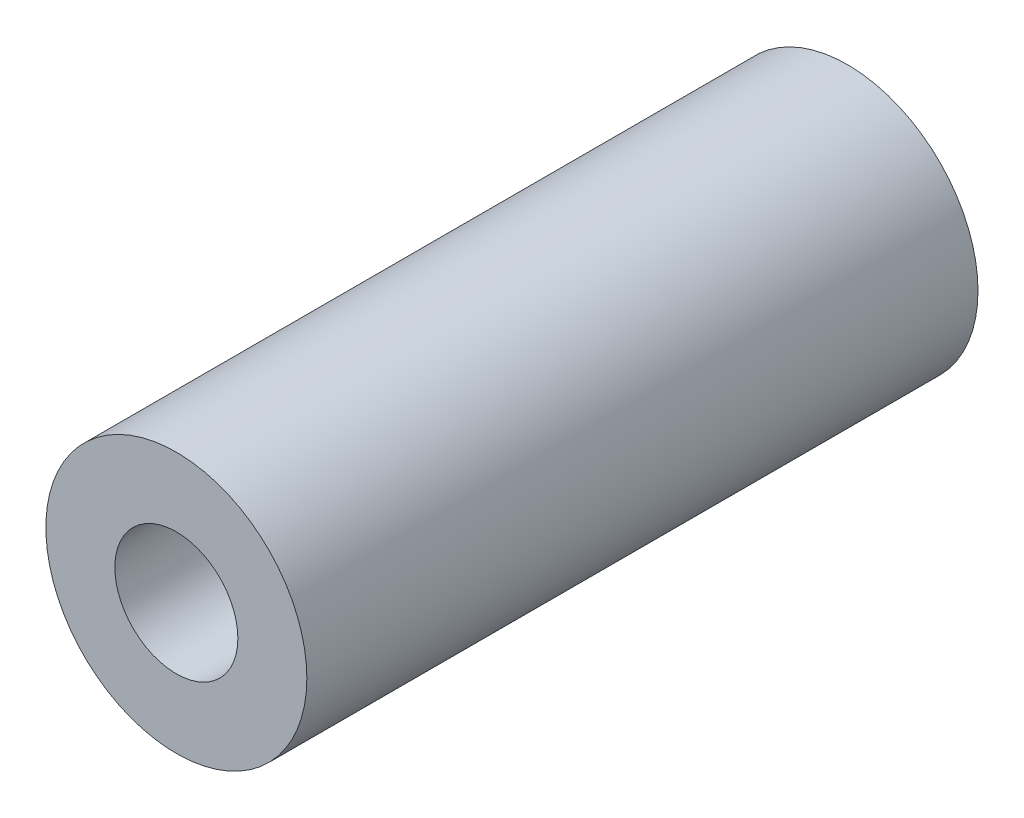
ISO-10303-21;
HEADER;
FILE_DESCRIPTION(('STEP AP214'),'2;1');
FILE_NAME('part.step','',(''),(''),'','','');
FILE_SCHEMA(('AUTOMOTIVE_DESIGN { 1 0 10303 214 1 1 1 1 }'));
ENDSEC;
DATA;
#1=APPLICATION_CONTEXT('core data for automotive mechanical design processes');
#2=APPLICATION_PROTOCOL_DEFINITION('international standard','automotive_design',2000,#1);
#3=PRODUCT_CONTEXT('',#1,'mechanical');
#4=PRODUCT('Part','Part','',(#3));
#5=PRODUCT_RELATED_PRODUCT_CATEGORY('part','',(#4));
#6=PRODUCT_DEFINITION_FORMATION('','',#4);
#7=PRODUCT_DEFINITION_CONTEXT('part definition',#1,'design');
#8=PRODUCT_DEFINITION('design','',#6,#7);
#9=PRODUCT_DEFINITION_SHAPE('','',#8);
#10=(LENGTH_UNIT() NAMED_UNIT(*) SI_UNIT(.MILLI.,.METRE.));
#11=(NAMED_UNIT(*) PLANE_ANGLE_UNIT() SI_UNIT($,.RADIAN.));
#12=(NAMED_UNIT(*) SI_UNIT($,.STERADIAN.) SOLID_ANGLE_UNIT());
#13=UNCERTAINTY_MEASURE_WITH_UNIT(LENGTH_MEASURE(1.E-05),#10,'distance_accuracy_value','');
#14=(GEOMETRIC_REPRESENTATION_CONTEXT(3) GLOBAL_UNCERTAINTY_ASSIGNED_CONTEXT((#13)) GLOBAL_UNIT_ASSIGNED_CONTEXT((#10,
#11,#12)) REPRESENTATION_CONTEXT('',''));
#15=CARTESIAN_POINT('',(0.,0.,0.));
#16=DIRECTION('',(0.,0.,1.));
#17=DIRECTION('',(1.,0.,0.));
#18=AXIS2_PLACEMENT_3D('',#15,#16,#17);
#19=CARTESIAN_POINT('',(0.,0.,18.));
#20=DIRECTION('',(0.,0.,1.));
#21=DIRECTION('',(1.,0.,0.));
#22=AXIS2_PLACEMENT_3D('',#19,#20,#21);
#23=PLANE('',#22);
#24=CARTESIAN_POINT('',(0.,0.,18.));
#25=DIRECTION('',(0.,0.,1.));
#26=DIRECTION('',(1.,0.,0.));
#27=AXIS2_PLACEMENT_3D('',#24,#25,#26);
#28=CIRCLE('',#27,3.5);
#29=CARTESIAN_POINT('',(3.5,0.,18.));
#30=VERTEX_POINT('',#29);
#31=EDGE_CURVE('E10',#30,#30,#28,.T.);
#32=ORIENTED_EDGE('',*,*,#31,.T.);
#33=EDGE_LOOP('',(#32));
#34=FACE_BOUND('',#33,.T.);
#35=CARTESIAN_POINT('',(0.,0.,18.));
#36=DIRECTION('',(0.,0.,1.));
#37=DIRECTION('',(1.,0.,0.));
#38=AXIS2_PLACEMENT_3D('',#35,#36,#37);
#39=CIRCLE('',#38,1.65);
#40=CARTESIAN_POINT('',(1.65,0.,18.));
#41=VERTEX_POINT('',#40);
#42=EDGE_CURVE('E48',#41,#41,#39,.T.);
#43=ORIENTED_EDGE('',*,*,#42,.F.);
#44=EDGE_LOOP('',(#43));
#45=FACE_BOUND('',#44,.T.);
#46=ADVANCED_FACE('F40',(#34,#45),#23,.T.);
#47=CARTESIAN_POINT('',(0.,0.,0.));
#48=DIRECTION('',(0.,0.,1.));
#49=DIRECTION('',(1.,0.,0.));
#50=AXIS2_PLACEMENT_3D('',#47,#48,#49);
#51=PLANE('',#50);
#52=CARTESIAN_POINT('',(0.,0.,0.));
#53=DIRECTION('',(0.,0.,1.));
#54=DIRECTION('',(1.,0.,0.));
#55=AXIS2_PLACEMENT_3D('',#52,#53,#54);
#56=CIRCLE('',#55,3.5);
#57=CARTESIAN_POINT('',(3.5,0.,0.));
#58=VERTEX_POINT('',#57);
#59=EDGE_CURVE('E41',#58,#58,#56,.T.);
#60=ORIENTED_EDGE('',*,*,#59,.F.);
#61=EDGE_LOOP('',(#60));
#62=FACE_BOUND('',#61,.T.);
#63=CARTESIAN_POINT('',(0.,0.,0.));
#64=DIRECTION('',(0.,0.,1.));
#65=DIRECTION('',(1.,0.,0.));
#66=AXIS2_PLACEMENT_3D('',#63,#64,#65);
#67=CIRCLE('',#66,1.65);
#68=CARTESIAN_POINT('',(1.65,0.,0.));
#69=VERTEX_POINT('',#68);
#70=EDGE_CURVE('E49',#69,#69,#67,.T.);
#71=ORIENTED_EDGE('',*,*,#70,.T.);
#72=EDGE_LOOP('',(#71));
#73=FACE_BOUND('',#72,.T.);
#74=ADVANCED_FACE('F58',(#62,#73),#51,.F.);
#75=CARTESIAN_POINT('',(0.,0.,18.));
#76=DIRECTION('',(0.,0.,-1.));
#77=DIRECTION('',(-1.,0.,0.));
#78=AXIS2_PLACEMENT_3D('',#75,#76,#77);
#79=CYLINDRICAL_SURFACE('',#78,3.5);
#80=ORIENTED_EDGE('',*,*,#31,.F.);
#81=EDGE_LOOP('',(#80));
#82=FACE_BOUND('',#81,.T.);
#83=ORIENTED_EDGE('',*,*,#59,.T.);
#84=EDGE_LOOP('',(#83));
#85=FACE_BOUND('',#84,.T.);
#86=ADVANCED_FACE('F39',(#82,#85),#79,.T.);
#87=CARTESIAN_POINT('',(0.,0.,18.));
#88=DIRECTION('',(0.,0.,-1.));
#89=DIRECTION('',(-1.,0.,0.));
#90=AXIS2_PLACEMENT_3D('',#87,#88,#89);
#91=CYLINDRICAL_SURFACE('',#90,1.65);
#92=ORIENTED_EDGE('',*,*,#42,.T.);
#93=EDGE_LOOP('',(#92));
#94=FACE_BOUND('',#93,.T.);
#95=ORIENTED_EDGE('',*,*,#70,.F.);
#96=EDGE_LOOP('',(#95));
#97=FACE_BOUND('',#96,.T.);
#98=ADVANCED_FACE('F57',(#94,#97),#91,.F.);
#99=CLOSED_SHELL('',(#46,#74,#86,#98));
#100=MANIFOLD_SOLID_BREP('B2',#99);
#101=ADVANCED_BREP_SHAPE_REPRESENTATION('',(#18,#100),#14);
#102=SHAPE_DEFINITION_REPRESENTATION(#9,#101);
ENDSEC;
END-ISO-10303-21;
